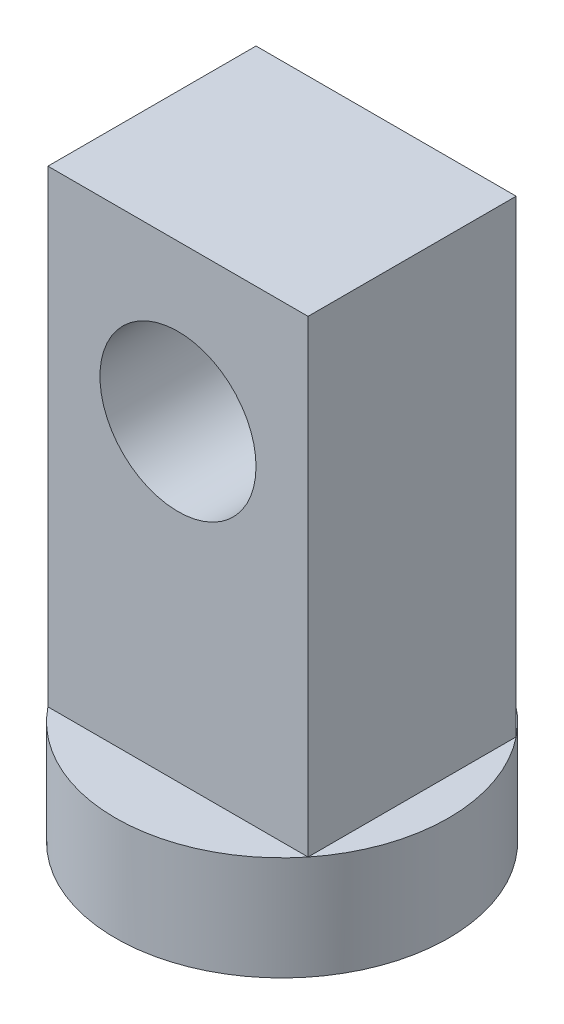
ISO-10303-21;
HEADER;
FILE_DESCRIPTION(('STEP AP214'),'2;1');
FILE_NAME('part.step','',(''),(''),'','','');
FILE_SCHEMA(('AUTOMOTIVE_DESIGN { 1 0 10303 214 1 1 1 1 }'));
ENDSEC;
DATA;
#1=APPLICATION_CONTEXT('core data for automotive mechanical design processes');
#2=APPLICATION_PROTOCOL_DEFINITION('international standard','automotive_design',2000,#1);
#3=PRODUCT_CONTEXT('',#1,'mechanical');
#4=PRODUCT('Part','Part','',(#3));
#5=PRODUCT_RELATED_PRODUCT_CATEGORY('part','',(#4));
#6=PRODUCT_DEFINITION_FORMATION('','',#4);
#7=PRODUCT_DEFINITION_CONTEXT('part definition',#1,'design');
#8=PRODUCT_DEFINITION('design','',#6,#7);
#9=PRODUCT_DEFINITION_SHAPE('','',#8);
#10=(LENGTH_UNIT() NAMED_UNIT(*) SI_UNIT(.MILLI.,.METRE.));
#11=(NAMED_UNIT(*) PLANE_ANGLE_UNIT() SI_UNIT($,.RADIAN.));
#12=(NAMED_UNIT(*) SI_UNIT($,.STERADIAN.) SOLID_ANGLE_UNIT());
#13=UNCERTAINTY_MEASURE_WITH_UNIT(LENGTH_MEASURE(1.E-05),#10,'distance_accuracy_value','');
#14=(GEOMETRIC_REPRESENTATION_CONTEXT(3) GLOBAL_UNCERTAINTY_ASSIGNED_CONTEXT((#13)) GLOBAL_UNIT_ASSIGNED_CONTEXT((#10,
#11,#12)) REPRESENTATION_CONTEXT('',''));
#15=CARTESIAN_POINT('',(0.,0.,0.));
#16=DIRECTION('',(0.,0.,1.));
#17=DIRECTION('',(1.,0.,0.));
#18=AXIS2_PLACEMENT_3D('',#15,#16,#17);
#19=CARTESIAN_POINT('',(0.,0.,20.));
#20=DIRECTION('',(0.,0.,-1.));
#21=DIRECTION('',(-1.,0.,0.));
#22=AXIS2_PLACEMENT_3D('',#19,#20,#21);
#23=PLANE('',#22);
#24=CARTESIAN_POINT('',(0.,0.,20.));
#25=DIRECTION('',(0.,0.,1.));
#26=DIRECTION('',(1.,0.,0.));
#27=AXIS2_PLACEMENT_3D('',#24,#25,#26);
#28=CIRCLE('',#27,15.);
#29=CARTESIAN_POINT('',(15.,0.,20.));
#30=VERTEX_POINT('',#29);
#31=EDGE_CURVE('E123',#30,#30,#28,.T.);
#32=ORIENTED_EDGE('',*,*,#31,.F.);
#33=EDGE_LOOP('',(#32));
#34=FACE_BOUND('',#33,.T.);
#35=DIRECTION('',(-1.,0.,0.));
#36=VECTOR('',#35,1.);
#37=CARTESIAN_POINT('',(0.,-60.,20.));
#38=LINE('',#37,#36);
#39=CARTESIAN_POINT('',(25.,-60.,20.));
#40=VERTEX_POINT('',#39);
#41=CARTESIAN_POINT('',(-25.,-60.,20.));
#42=VERTEX_POINT('',#41);
#43=EDGE_CURVE('E54',#40,#42,#38,.T.);
#44=ORIENTED_EDGE('',*,*,#43,.F.);
#45=DIRECTION('',(0.,1.,0.));
#46=VECTOR('',#45,1.);
#47=CARTESIAN_POINT('',(25.,-80.,20.));
#48=LINE('',#47,#46);
#49=CARTESIAN_POINT('',(25.,30.,20.));
#50=VERTEX_POINT('',#49);
#51=EDGE_CURVE('E89',#40,#50,#48,.T.);
#52=ORIENTED_EDGE('',*,*,#51,.T.);
#53=DIRECTION('',(-1.,0.,0.));
#54=VECTOR('',#53,1.);
#55=CARTESIAN_POINT('',(-25.,30.,20.));
#56=LINE('',#55,#54);
#57=CARTESIAN_POINT('',(-25.,30.,20.));
#58=VERTEX_POINT('',#57);
#59=EDGE_CURVE('E129',#50,#58,#56,.T.);
#60=ORIENTED_EDGE('',*,*,#59,.T.);
#61=DIRECTION('',(0.,-1.,0.));
#62=VECTOR('',#61,1.);
#63=CARTESIAN_POINT('',(-25.,-80.,20.));
#64=LINE('',#63,#62);
#65=EDGE_CURVE('E131',#58,#42,#64,.T.);
#66=ORIENTED_EDGE('',*,*,#65,.T.);
#67=EDGE_LOOP('',(#44,#52,#60,#66));
#68=FACE_BOUND('',#67,.T.);
#69=ADVANCED_FACE('F39',(#34,#68),#23,.F.);
#70=CARTESIAN_POINT('',(0.,0.,-20.));
#71=DIRECTION('',(0.,0.,-1.));
#72=DIRECTION('',(-1.,0.,0.));
#73=AXIS2_PLACEMENT_3D('',#70,#71,#72);
#74=PLANE('',#73);
#75=CARTESIAN_POINT('',(0.,0.,-20.));
#76=DIRECTION('',(0.,0.,1.));
#77=DIRECTION('',(1.,0.,0.));
#78=AXIS2_PLACEMENT_3D('',#75,#76,#77);
#79=CIRCLE('',#78,15.);
#80=CARTESIAN_POINT('',(15.,0.,-20.));
#81=VERTEX_POINT('',#80);
#82=EDGE_CURVE('E122',#81,#81,#79,.T.);
#83=ORIENTED_EDGE('',*,*,#82,.T.);
#84=EDGE_LOOP('',(#83));
#85=FACE_BOUND('',#84,.T.);
#86=DIRECTION('',(0.,1.,0.));
#87=VECTOR('',#86,1.);
#88=CARTESIAN_POINT('',(25.,-80.,-20.));
#89=LINE('',#88,#87);
#90=CARTESIAN_POINT('',(25.,-60.,-20.));
#91=VERTEX_POINT('',#90);
#92=CARTESIAN_POINT('',(25.,30.,-20.));
#93=VERTEX_POINT('',#92);
#94=EDGE_CURVE('E95',#91,#93,#89,.T.);
#95=ORIENTED_EDGE('',*,*,#94,.F.);
#96=DIRECTION('',(-1.,0.,0.));
#97=VECTOR('',#96,1.);
#98=CARTESIAN_POINT('',(0.,-60.,-20.));
#99=LINE('',#98,#97);
#100=CARTESIAN_POINT('',(-25.,-60.,-20.));
#101=VERTEX_POINT('',#100);
#102=EDGE_CURVE('E93',#91,#101,#99,.T.);
#103=ORIENTED_EDGE('',*,*,#102,.T.);
#104=DIRECTION('',(0.,-1.,0.));
#105=VECTOR('',#104,1.);
#106=CARTESIAN_POINT('',(-25.,-80.,-20.));
#107=LINE('',#106,#105);
#108=CARTESIAN_POINT('',(-25.,30.,-20.));
#109=VERTEX_POINT('',#108);
#110=EDGE_CURVE('E81',#109,#101,#107,.T.);
#111=ORIENTED_EDGE('',*,*,#110,.F.);
#112=DIRECTION('',(-1.,0.,0.));
#113=VECTOR('',#112,1.);
#114=CARTESIAN_POINT('',(-25.,30.,-20.));
#115=LINE('',#114,#113);
#116=EDGE_CURVE('E90',#93,#109,#115,.T.);
#117=ORIENTED_EDGE('',*,*,#116,.F.);
#118=EDGE_LOOP('',(#95,#103,#111,#117));
#119=FACE_BOUND('',#118,.T.);
#120=ADVANCED_FACE('F94',(#85,#119),#74,.T.);
#121=CARTESIAN_POINT('',(25.,-80.,20.));
#122=DIRECTION('',(-1.,0.,0.));
#123=DIRECTION('',(0.,0.,1.));
#124=AXIS2_PLACEMENT_3D('',#121,#122,#123);
#125=PLANE('',#124);
#126=DIRECTION('',(0.,0.,1.));
#127=VECTOR('',#126,1.);
#128=CARTESIAN_POINT('',(25.,-60.,20.));
#129=LINE('',#128,#127);
#130=EDGE_CURVE('E61',#91,#40,#129,.T.);
#131=ORIENTED_EDGE('',*,*,#130,.F.);
#132=ORIENTED_EDGE('',*,*,#94,.T.);
#133=DIRECTION('',(0.,0.,-1.));
#134=VECTOR('',#133,1.);
#135=CARTESIAN_POINT('',(25.,30.,20.));
#136=LINE('',#135,#134);
#137=EDGE_CURVE('E47',#50,#93,#136,.T.);
#138=ORIENTED_EDGE('',*,*,#137,.F.);
#139=ORIENTED_EDGE('',*,*,#51,.F.);
#140=EDGE_LOOP('',(#131,#132,#138,#139));
#141=FACE_BOUND('',#140,.T.);
#142=ADVANCED_FACE('F41',(#141),#125,.F.);
#143=CARTESIAN_POINT('',(-25.,-80.,20.));
#144=DIRECTION('',(1.,0.,0.));
#145=DIRECTION('',(0.,0.,-1.));
#146=AXIS2_PLACEMENT_3D('',#143,#144,#145);
#147=PLANE('',#146);
#148=DIRECTION('',(0.,0.,-1.));
#149=VECTOR('',#148,1.);
#150=CARTESIAN_POINT('',(-25.,-60.,20.));
#151=LINE('',#150,#149);
#152=EDGE_CURVE('E11',#42,#101,#151,.T.);
#153=ORIENTED_EDGE('',*,*,#152,.F.);
#154=ORIENTED_EDGE('',*,*,#65,.F.);
#155=DIRECTION('',(0.,0.,-1.));
#156=VECTOR('',#155,1.);
#157=CARTESIAN_POINT('',(-25.,30.,20.));
#158=LINE('',#157,#156);
#159=EDGE_CURVE('E86',#58,#109,#158,.T.);
#160=ORIENTED_EDGE('',*,*,#159,.T.);
#161=ORIENTED_EDGE('',*,*,#110,.T.);
#162=EDGE_LOOP('',(#153,#154,#160,#161));
#163=FACE_BOUND('',#162,.T.);
#164=ADVANCED_FACE('F83',(#163),#147,.F.);
#165=CARTESIAN_POINT('',(-25.,30.,20.));
#166=DIRECTION('',(0.,-1.,0.));
#167=DIRECTION('',(0.,0.,-1.));
#168=AXIS2_PLACEMENT_3D('',#165,#166,#167);
#169=PLANE('',#168);
#170=ORIENTED_EDGE('',*,*,#116,.T.);
#171=ORIENTED_EDGE('',*,*,#159,.F.);
#172=ORIENTED_EDGE('',*,*,#59,.F.);
#173=ORIENTED_EDGE('',*,*,#137,.T.);
#174=EDGE_LOOP('',(#170,#171,#172,#173));
#175=FACE_BOUND('',#174,.T.);
#176=ADVANCED_FACE('F139',(#175),#169,.F.);
#177=CARTESIAN_POINT('',(0.,0.,20.));
#178=DIRECTION('',(0.,0.,-1.));
#179=DIRECTION('',(-1.,0.,0.));
#180=AXIS2_PLACEMENT_3D('',#177,#178,#179);
#181=CYLINDRICAL_SURFACE('',#180,15.);
#182=ORIENTED_EDGE('',*,*,#31,.T.);
#183=EDGE_LOOP('',(#182));
#184=FACE_BOUND('',#183,.T.);
#185=ORIENTED_EDGE('',*,*,#82,.F.);
#186=EDGE_LOOP('',(#185));
#187=FACE_BOUND('',#186,.T.);
#188=ADVANCED_FACE('F150',(#184,#187),#181,.F.);
#189=CARTESIAN_POINT('',(0.,-60.,0.));
#190=DIRECTION('',(0.,-1.,0.));
#191=DIRECTION('',(0.,0.,-1.));
#192=AXIS2_PLACEMENT_3D('',#189,#190,#191);
#193=PLANE('',#192);
#194=CARTESIAN_POINT('',(0.,-60.,0.));
#195=DIRECTION('',(0.,-1.,0.));
#196=DIRECTION('',(0.,0.,-1.));
#197=AXIS2_PLACEMENT_3D('',#194,#195,#196);
#198=CIRCLE('',#197,32.0156211871642);
#199=EDGE_CURVE('E99',#91,#40,#198,.T.);
#200=ORIENTED_EDGE('',*,*,#199,.F.);
#201=ORIENTED_EDGE('',*,*,#130,.T.);
#202=EDGE_LOOP('',(#200,#201));
#203=FACE_BOUND('',#202,.T.);
#204=ADVANCED_FACE('F141',(#203),#193,.F.);
#205=EDGE_CURVE('E116',#40,#42,#198,.T.);
#206=ORIENTED_EDGE('',*,*,#205,.F.);
#207=ORIENTED_EDGE('',*,*,#43,.T.);
#208=EDGE_LOOP('',(#206,#207));
#209=FACE_BOUND('',#208,.T.);
#210=ADVANCED_FACE('F143',(#209),#193,.F.);
#211=EDGE_CURVE('E105',#42,#101,#198,.T.);
#212=ORIENTED_EDGE('',*,*,#211,.F.);
#213=ORIENTED_EDGE('',*,*,#152,.T.);
#214=EDGE_LOOP('',(#212,#213));
#215=FACE_BOUND('',#214,.T.);
#216=ADVANCED_FACE('F103',(#215),#193,.F.);
#217=CARTESIAN_POINT('',(0.,-60.,0.));
#218=DIRECTION('',(0.,-1.,0.));
#219=DIRECTION('',(0.,0.,-1.));
#220=AXIS2_PLACEMENT_3D('',#217,#218,#219);
#221=CYLINDRICAL_SURFACE('',#220,32.0156211871642);
#222=CARTESIAN_POINT('',(0.,-80.,0.));
#223=DIRECTION('',(0.,-1.,0.));
#224=DIRECTION('',(0.,0.,-1.));
#225=AXIS2_PLACEMENT_3D('',#222,#223,#224);
#226=CIRCLE('',#225,32.0156211871642);
#227=CARTESIAN_POINT('',(0.,-80.,-32.0156211871642));
#228=VERTEX_POINT('',#227);
#229=EDGE_CURVE('E112',#228,#228,#226,.T.);
#230=ORIENTED_EDGE('',*,*,#229,.F.);
#231=EDGE_LOOP('',(#230));
#232=FACE_BOUND('',#231,.T.);
#233=EDGE_CURVE('E107',#101,#91,#198,.T.);
#234=ORIENTED_EDGE('',*,*,#233,.T.);
#235=ORIENTED_EDGE('',*,*,#199,.T.);
#236=ORIENTED_EDGE('',*,*,#205,.T.);
#237=ORIENTED_EDGE('',*,*,#211,.T.);
#238=EDGE_LOOP('',(#234,#235,#236,#237));
#239=FACE_BOUND('',#238,.T.);
#240=ADVANCED_FACE('F114',(#232,#239),#221,.T.);
#241=ORIENTED_EDGE('',*,*,#102,.F.);
#242=ORIENTED_EDGE('',*,*,#233,.F.);
#243=EDGE_LOOP('',(#241,#242));
#244=FACE_BOUND('',#243,.T.);
#245=ADVANCED_FACE('F108',(#244),#193,.F.);
#246=CARTESIAN_POINT('',(-25.,-80.,20.));
#247=DIRECTION('',(0.,1.,0.));
#248=DIRECTION('',(0.,0.,1.));
#249=AXIS2_PLACEMENT_3D('',#246,#247,#248);
#250=PLANE('',#249);
#251=ORIENTED_EDGE('',*,*,#229,.T.);
#252=EDGE_LOOP('',(#251));
#253=FACE_BOUND('',#252,.T.);
#254=ADVANCED_FACE('F164',(#253),#250,.F.);
#255=CLOSED_SHELL('',(#69,#120,#142,#164,#176,#188,#204,#210,#216,#240,#245,#254));
#256=MANIFOLD_SOLID_BREP('B2',#255);
#257=ADVANCED_BREP_SHAPE_REPRESENTATION('',(#18,#256),#14);
#258=SHAPE_DEFINITION_REPRESENTATION(#9,#257);
ENDSEC;
END-ISO-10303-21;
